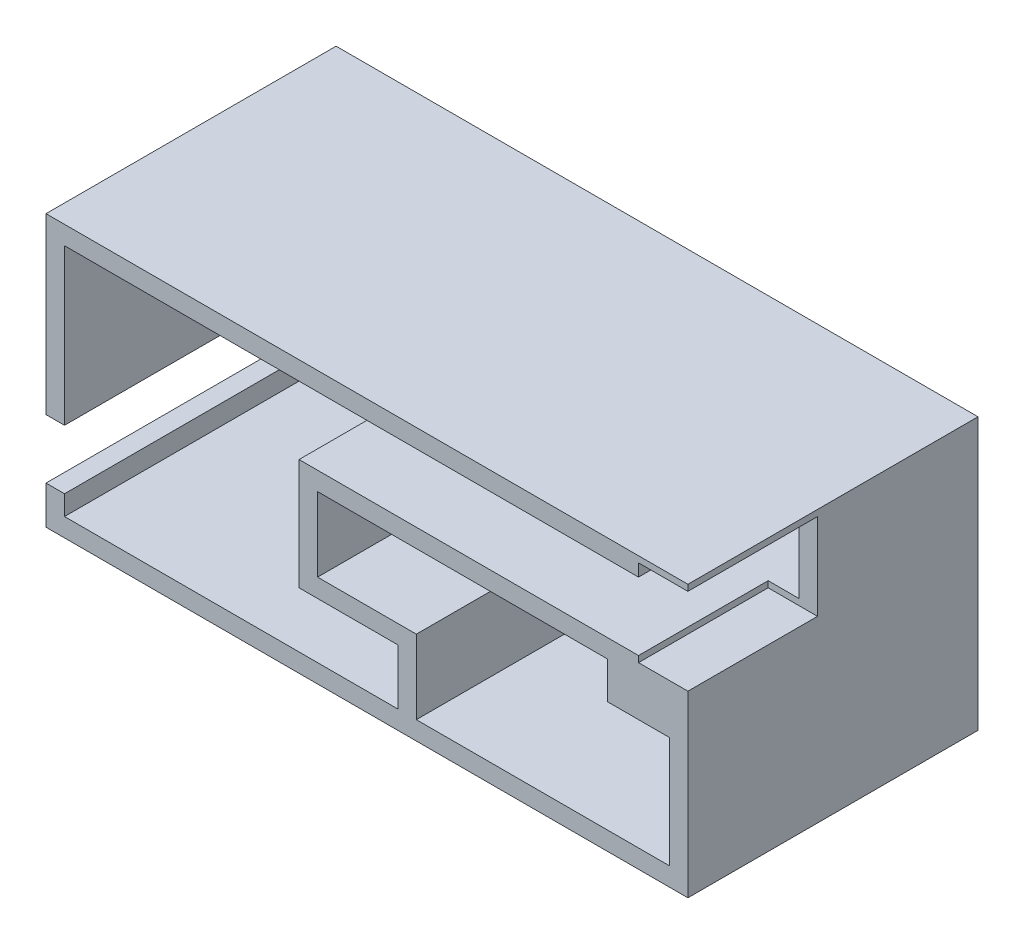
ISO-10303-21;
HEADER;
FILE_DESCRIPTION(('STEP AP214'),'2;1');
FILE_NAME('part.step','',(''),(''),'','','');
FILE_SCHEMA(('AUTOMOTIVE_DESIGN { 1 0 10303 214 1 1 1 1 }'));
ENDSEC;
DATA;
#1=APPLICATION_CONTEXT('core data for automotive mechanical design processes');
#2=APPLICATION_PROTOCOL_DEFINITION('international standard','automotive_design',2000,#1);
#3=PRODUCT_CONTEXT('',#1,'mechanical');
#4=PRODUCT('Part','Part','',(#3));
#5=PRODUCT_RELATED_PRODUCT_CATEGORY('part','',(#4));
#6=PRODUCT_DEFINITION_FORMATION('','',#4);
#7=PRODUCT_DEFINITION_CONTEXT('part definition',#1,'design');
#8=PRODUCT_DEFINITION('design','',#6,#7);
#9=PRODUCT_DEFINITION_SHAPE('','',#8);
#10=(LENGTH_UNIT() NAMED_UNIT(*) SI_UNIT(.MILLI.,.METRE.));
#11=(NAMED_UNIT(*) PLANE_ANGLE_UNIT() SI_UNIT($,.RADIAN.));
#12=(NAMED_UNIT(*) SI_UNIT($,.STERADIAN.) SOLID_ANGLE_UNIT());
#13=UNCERTAINTY_MEASURE_WITH_UNIT(LENGTH_MEASURE(1.E-05),#10,'distance_accuracy_value','');
#14=(GEOMETRIC_REPRESENTATION_CONTEXT(3) GLOBAL_UNCERTAINTY_ASSIGNED_CONTEXT((#13)) GLOBAL_UNIT_ASSIGNED_CONTEXT((#10,
#11,#12)) REPRESENTATION_CONTEXT('',''));
#15=CARTESIAN_POINT('',(0.,0.,0.));
#16=DIRECTION('',(0.,0.,1.));
#17=DIRECTION('',(1.,0.,0.));
#18=AXIS2_PLACEMENT_3D('',#15,#16,#17);
#19=CARTESIAN_POINT('',(0.,0.,23.5));
#20=DIRECTION('',(0.,0.,1.));
#21=DIRECTION('',(1.,0.,0.));
#22=AXIS2_PLACEMENT_3D('',#19,#20,#21);
#23=PLANE('',#22);
#24=DIRECTION('',(1.,0.,0.));
#25=VECTOR('',#24,1.);
#26=CARTESIAN_POINT('',(28.718487394958,21.5,23.5));
#27=LINE('',#26,#25);
#28=CARTESIAN_POINT('',(28.718487394958,21.5,23.5));
#29=VERTEX_POINT('',#28);
#30=CARTESIAN_POINT('',(32.718487394958,21.5,23.5));
#31=VERTEX_POINT('',#30);
#32=EDGE_CURVE('E269',#29,#31,#27,.T.);
#33=ORIENTED_EDGE('',*,*,#32,.T.);
#34=DIRECTION('',(0.,1.,0.));
#35=VECTOR('',#34,1.);
#36=CARTESIAN_POINT('',(32.718487394958,0.,23.5));
#37=LINE('',#36,#35);
#38=CARTESIAN_POINT('',(32.718487394958,22.,23.5));
#39=VERTEX_POINT('',#38);
#40=EDGE_CURVE('E412',#31,#39,#37,.T.);
#41=ORIENTED_EDGE('',*,*,#40,.T.);
#42=DIRECTION('',(-1.,0.,0.));
#43=VECTOR('',#42,1.);
#44=CARTESIAN_POINT('',(32.718487394958,22.,23.5));
#45=LINE('',#44,#43);
#46=CARTESIAN_POINT('',(-19.281512605042,22.,23.5));
#47=VERTEX_POINT('',#46);
#48=EDGE_CURVE('E403',#39,#47,#45,.T.);
#49=ORIENTED_EDGE('',*,*,#48,.T.);
#50=DIRECTION('',(0.,-1.,0.));
#51=VECTOR('',#50,1.);
#52=CARTESIAN_POINT('',(-19.281512605042,22.,23.5));
#53=LINE('',#52,#51);
#54=CARTESIAN_POINT('',(-19.281512605042,7.9,23.5));
#55=VERTEX_POINT('',#54);
#56=EDGE_CURVE('E407',#47,#55,#53,.T.);
#57=ORIENTED_EDGE('',*,*,#56,.T.);
#58=DIRECTION('',(-1.,0.,0.));
#59=VECTOR('',#58,1.);
#60=CARTESIAN_POINT('',(-14.281512605042,7.9,23.5));
#61=LINE('',#60,#59);
#62=CARTESIAN_POINT('',(-17.781512605042,7.9,23.5));
#63=VERTEX_POINT('',#62);
#64=EDGE_CURVE('E280',#63,#55,#61,.T.);
#65=ORIENTED_EDGE('',*,*,#64,.F.);
#66=DIRECTION('',(0.,-1.,0.));
#67=VECTOR('',#66,1.);
#68=CARTESIAN_POINT('',(-17.781512605042,20.5,23.5));
#69=LINE('',#68,#67);
#70=CARTESIAN_POINT('',(-17.781512605042,20.5,23.5));
#71=VERTEX_POINT('',#70);
#72=EDGE_CURVE('E351',#71,#63,#69,.T.);
#73=ORIENTED_EDGE('',*,*,#72,.F.);
#74=DIRECTION('',(-1.,0.,0.));
#75=VECTOR('',#74,1.);
#76=CARTESIAN_POINT('',(31.218487394958,20.5,23.5));
#77=LINE('',#76,#75);
#78=CARTESIAN_POINT('',(28.718487394958,20.5,23.5));
#79=VERTEX_POINT('',#78);
#80=EDGE_CURVE('E347',#79,#71,#77,.T.);
#81=ORIENTED_EDGE('',*,*,#80,.F.);
#82=DIRECTION('',(0.,-1.,0.));
#83=VECTOR('',#82,1.);
#84=CARTESIAN_POINT('',(28.718487394958,21.5,23.5));
#85=LINE('',#84,#83);
#86=EDGE_CURVE('E240',#29,#79,#85,.T.);
#87=ORIENTED_EDGE('',*,*,#86,.F.);
#88=EDGE_LOOP('',(#33,#41,#49,#57,#65,#73,#81,#87));
#89=FACE_BOUND('',#88,.T.);
#90=ADVANCED_FACE('F33',(#89),#23,.T.);
#91=CARTESIAN_POINT('',(-19.281512605042,0.,1.5));
#92=DIRECTION('',(1.,0.,0.));
#93=DIRECTION('',(0.,0.,-1.));
#94=AXIS2_PLACEMENT_3D('',#91,#92,#93);
#95=PLANE('',#94);
#96=CARTESIAN_POINT('',(-19.281512605042,3.1,23.5));
#97=VERTEX_POINT('',#96);
#98=CARTESIAN_POINT('',(-19.281512605042,0.,23.5));
#99=VERTEX_POINT('',#98);
#100=EDGE_CURVE('E406',#97,#99,#53,.T.);
#101=ORIENTED_EDGE('',*,*,#100,.F.);
#102=DIRECTION('',(0.,0.,1.));
#103=VECTOR('',#102,1.);
#104=CARTESIAN_POINT('',(-19.281512605042,3.1,17.75));
#105=LINE('',#104,#103);
#106=CARTESIAN_POINT('',(-19.281512605042,3.1,5.75));
#107=VERTEX_POINT('',#106);
#108=EDGE_CURVE('E278',#107,#97,#105,.T.);
#109=ORIENTED_EDGE('',*,*,#108,.F.);
#110=DIRECTION('',(0.,-1.,0.));
#111=VECTOR('',#110,1.);
#112=CARTESIAN_POINT('',(-19.281512605042,3.1,5.75));
#113=LINE('',#112,#111);
#114=CARTESIAN_POINT('',(-19.281512605042,7.9,5.75));
#115=VERTEX_POINT('',#114);
#116=EDGE_CURVE('E275',#115,#107,#113,.T.);
#117=ORIENTED_EDGE('',*,*,#116,.F.);
#118=DIRECTION('',(0.,0.,-1.));
#119=VECTOR('',#118,1.);
#120=CARTESIAN_POINT('',(-19.281512605042,7.9,5.75));
#121=LINE('',#120,#119);
#122=EDGE_CURVE('E273',#55,#115,#121,.T.);
#123=ORIENTED_EDGE('',*,*,#122,.F.);
#124=ORIENTED_EDGE('',*,*,#56,.F.);
#125=DIRECTION('',(0.,0.,-1.));
#126=VECTOR('',#125,1.);
#127=CARTESIAN_POINT('',(-19.281512605042,22.,1.5));
#128=LINE('',#127,#126);
#129=CARTESIAN_POINT('',(-19.281512605042,22.,0.));
#130=VERTEX_POINT('',#129);
#131=EDGE_CURVE('E423',#47,#130,#128,.T.);
#132=ORIENTED_EDGE('',*,*,#131,.T.);
#133=DIRECTION('',(0.,-1.,0.));
#134=VECTOR('',#133,1.);
#135=CARTESIAN_POINT('',(-19.281512605042,0.,0.));
#136=LINE('',#135,#134);
#137=CARTESIAN_POINT('',(-19.281512605042,0.,0.));
#138=VERTEX_POINT('',#137);
#139=EDGE_CURVE('E414',#130,#138,#136,.T.);
#140=ORIENTED_EDGE('',*,*,#139,.T.);
#141=DIRECTION('',(0.,0.,-1.));
#142=VECTOR('',#141,1.);
#143=CARTESIAN_POINT('',(-19.281512605042,0.,1.5));
#144=LINE('',#143,#142);
#145=EDGE_CURVE('E432',#99,#138,#144,.T.);
#146=ORIENTED_EDGE('',*,*,#145,.F.);
#147=EDGE_LOOP('',(#101,#109,#117,#123,#124,#132,#140,#146));
#148=FACE_BOUND('',#147,.T.);
#149=ADVANCED_FACE('F35',(#148),#95,.F.);
#150=CARTESIAN_POINT('',(-19.281512605042,0.,1.5));
#151=DIRECTION('',(0.,1.,0.));
#152=DIRECTION('',(0.,0.,1.));
#153=AXIS2_PLACEMENT_3D('',#150,#151,#152);
#154=PLANE('',#153);
#155=DIRECTION('',(1.,0.,0.));
#156=VECTOR('',#155,1.);
#157=CARTESIAN_POINT('',(-19.281512605042,0.,0.));
#158=LINE('',#157,#156);
#159=CARTESIAN_POINT('',(32.718487394958,0.,0.));
#160=VERTEX_POINT('',#159);
#161=EDGE_CURVE('E417',#138,#160,#158,.T.);
#162=ORIENTED_EDGE('',*,*,#161,.T.);
#163=DIRECTION('',(0.,0.,-1.));
#164=VECTOR('',#163,1.);
#165=CARTESIAN_POINT('',(32.718487394958,0.,1.5));
#166=LINE('',#165,#164);
#167=CARTESIAN_POINT('',(32.718487394958,0.,23.5));
#168=VERTEX_POINT('',#167);
#169=EDGE_CURVE('E429',#168,#160,#166,.T.);
#170=ORIENTED_EDGE('',*,*,#169,.F.);
#171=DIRECTION('',(1.,0.,0.));
#172=VECTOR('',#171,1.);
#173=CARTESIAN_POINT('',(-19.281512605042,0.,23.5));
#174=LINE('',#173,#172);
#175=EDGE_CURVE('E410',#99,#168,#174,.T.);
#176=ORIENTED_EDGE('',*,*,#175,.F.);
#177=ORIENTED_EDGE('',*,*,#145,.T.);
#178=EDGE_LOOP('',(#162,#170,#176,#177));
#179=FACE_BOUND('',#178,.T.);
#180=ADVANCED_FACE('F495',(#179),#154,.F.);
#181=CARTESIAN_POINT('',(32.718487394958,0.,1.5));
#182=DIRECTION('',(-1.,0.,0.));
#183=DIRECTION('',(0.,-1.,0.));
#184=AXIS2_PLACEMENT_3D('',#181,#182,#183);
#185=PLANE('',#184);
#186=ORIENTED_EDGE('',*,*,#40,.F.);
#187=DIRECTION('',(0.,0.,1.));
#188=VECTOR('',#187,1.);
#189=CARTESIAN_POINT('',(32.718487394958,21.5,23.5));
#190=LINE('',#189,#188);
#191=CARTESIAN_POINT('',(32.718487394958,21.5,13.));
#192=VERTEX_POINT('',#191);
#193=EDGE_CURVE('E241',#192,#31,#190,.T.);
#194=ORIENTED_EDGE('',*,*,#193,.F.);
#195=DIRECTION('',(0.,1.,0.));
#196=VECTOR('',#195,1.);
#197=CARTESIAN_POINT('',(32.718487394958,21.5,13.));
#198=LINE('',#197,#196);
#199=CARTESIAN_POINT('',(32.718487394958,14.5,13.));
#200=VERTEX_POINT('',#199);
#201=EDGE_CURVE('E515',#200,#192,#198,.T.);
#202=ORIENTED_EDGE('',*,*,#201,.F.);
#203=DIRECTION('',(0.,0.,-1.));
#204=VECTOR('',#203,1.);
#205=CARTESIAN_POINT('',(32.718487394958,14.5,13.));
#206=LINE('',#205,#204);
#207=CARTESIAN_POINT('',(32.718487394958,14.5,23.5));
#208=VERTEX_POINT('',#207);
#209=EDGE_CURVE('E518',#208,#200,#206,.T.);
#210=ORIENTED_EDGE('',*,*,#209,.F.);
#211=EDGE_CURVE('E257',#168,#208,#37,.T.);
#212=ORIENTED_EDGE('',*,*,#211,.F.);
#213=ORIENTED_EDGE('',*,*,#169,.T.);
#214=DIRECTION('',(0.,1.,0.));
#215=VECTOR('',#214,1.);
#216=CARTESIAN_POINT('',(32.718487394958,0.,0.));
#217=LINE('',#216,#215);
#218=CARTESIAN_POINT('',(32.718487394958,22.,0.));
#219=VERTEX_POINT('',#218);
#220=EDGE_CURVE('E419',#160,#219,#217,.T.);
#221=ORIENTED_EDGE('',*,*,#220,.T.);
#222=DIRECTION('',(0.,0.,-1.));
#223=VECTOR('',#222,1.);
#224=CARTESIAN_POINT('',(32.718487394958,22.,1.5));
#225=LINE('',#224,#223);
#226=EDGE_CURVE('E426',#39,#219,#225,.T.);
#227=ORIENTED_EDGE('',*,*,#226,.F.);
#228=EDGE_LOOP('',(#186,#194,#202,#210,#212,#213,#221,#227));
#229=FACE_BOUND('',#228,.T.);
#230=ADVANCED_FACE('F499',(#229),#185,.F.);
#231=CARTESIAN_POINT('',(-19.281512605042,22.,1.5));
#232=DIRECTION('',(0.,-1.,0.));
#233=DIRECTION('',(0.,0.,-1.));
#234=AXIS2_PLACEMENT_3D('',#231,#232,#233);
#235=PLANE('',#234);
#236=DIRECTION('',(-1.,0.,0.));
#237=VECTOR('',#236,1.);
#238=CARTESIAN_POINT('',(-19.281512605042,22.,0.));
#239=LINE('',#238,#237);
#240=EDGE_CURVE('E421',#219,#130,#239,.T.);
#241=ORIENTED_EDGE('',*,*,#240,.T.);
#242=ORIENTED_EDGE('',*,*,#131,.F.);
#243=ORIENTED_EDGE('',*,*,#48,.F.);
#244=ORIENTED_EDGE('',*,*,#226,.T.);
#245=EDGE_LOOP('',(#241,#242,#243,#244));
#246=FACE_BOUND('',#245,.T.);
#247=ADVANCED_FACE('F505',(#246),#235,.F.);
#248=CARTESIAN_POINT('',(0.,0.,0.));
#249=DIRECTION('',(0.,0.,-1.));
#250=DIRECTION('',(-1.,0.,0.));
#251=AXIS2_PLACEMENT_3D('',#248,#249,#250);
#252=PLANE('',#251);
#253=ORIENTED_EDGE('',*,*,#139,.F.);
#254=ORIENTED_EDGE('',*,*,#240,.F.);
#255=ORIENTED_EDGE('',*,*,#220,.F.);
#256=ORIENTED_EDGE('',*,*,#161,.F.);
#257=EDGE_LOOP('',(#253,#254,#255,#256));
#258=FACE_BOUND('',#257,.T.);
#259=ADVANCED_FACE('F503',(#258),#252,.T.);
#260=DIRECTION('',(1.,0.,0.));
#261=VECTOR('',#260,1.);
#262=CARTESIAN_POINT('',(28.718487394958,14.5,23.5));
#263=LINE('',#262,#261);
#264=CARTESIAN_POINT('',(28.718487394958,14.5,23.5));
#265=VERTEX_POINT('',#264);
#266=EDGE_CURVE('E246',#265,#208,#263,.T.);
#267=ORIENTED_EDGE('',*,*,#266,.F.);
#268=CARTESIAN_POINT('',(28.718487394958,15.,23.5));
#269=VERTEX_POINT('',#268);
#270=EDGE_CURVE('E230',#269,#265,#85,.T.);
#271=ORIENTED_EDGE('',*,*,#270,.F.);
#272=DIRECTION('',(1.,0.,0.));
#273=VECTOR('',#272,1.);
#274=CARTESIAN_POINT('',(31.218487394958,15.,23.5));
#275=LINE('',#274,#273);
#276=CARTESIAN_POINT('',(1.21848739495798,15.,23.5));
#277=VERTEX_POINT('',#276);
#278=EDGE_CURVE('E362',#277,#269,#275,.T.);
#279=ORIENTED_EDGE('',*,*,#278,.F.);
#280=DIRECTION('',(0.,1.,0.));
#281=VECTOR('',#280,1.);
#282=CARTESIAN_POINT('',(1.21848739495798,15.,23.5));
#283=LINE('',#282,#281);
#284=CARTESIAN_POINT('',(1.21848739495798,6.,23.5));
#285=VERTEX_POINT('',#284);
#286=EDGE_CURVE('E360',#285,#277,#283,.T.);
#287=ORIENTED_EDGE('',*,*,#286,.F.);
#288=DIRECTION('',(-1.,0.,0.));
#289=VECTOR('',#288,1.);
#290=CARTESIAN_POINT('',(1.21848739495798,6.,23.5));
#291=LINE('',#290,#289);
#292=CARTESIAN_POINT('',(9.21848739495798,6.,23.5));
#293=VERTEX_POINT('',#292);
#294=EDGE_CURVE('E358',#293,#285,#291,.T.);
#295=ORIENTED_EDGE('',*,*,#294,.F.);
#296=DIRECTION('',(0.,1.,0.));
#297=VECTOR('',#296,1.);
#298=CARTESIAN_POINT('',(9.21848739495798,6.,23.5));
#299=LINE('',#298,#297);
#300=CARTESIAN_POINT('',(9.21848739495798,1.5,23.5));
#301=VERTEX_POINT('',#300);
#302=EDGE_CURVE('E356',#301,#293,#299,.T.);
#303=ORIENTED_EDGE('',*,*,#302,.F.);
#304=DIRECTION('',(1.,0.,0.));
#305=VECTOR('',#304,1.);
#306=CARTESIAN_POINT('',(-17.781512605042,1.5,23.5));
#307=LINE('',#306,#305);
#308=CARTESIAN_POINT('',(-17.781512605042,1.5,23.5));
#309=VERTEX_POINT('',#308);
#310=EDGE_CURVE('E354',#309,#301,#307,.T.);
#311=ORIENTED_EDGE('',*,*,#310,.F.);
#312=CARTESIAN_POINT('',(-17.781512605042,3.1,23.5));
#313=VERTEX_POINT('',#312);
#314=EDGE_CURVE('E349',#313,#309,#69,.T.);
#315=ORIENTED_EDGE('',*,*,#314,.F.);
#316=DIRECTION('',(-1.,0.,0.));
#317=VECTOR('',#316,1.);
#318=CARTESIAN_POINT('',(-14.281512605042,3.1,23.5));
#319=LINE('',#318,#317);
#320=EDGE_CURVE('E283',#313,#97,#319,.T.);
#321=ORIENTED_EDGE('',*,*,#320,.T.);
#322=ORIENTED_EDGE('',*,*,#100,.T.);
#323=ORIENTED_EDGE('',*,*,#175,.T.);
#324=ORIENTED_EDGE('',*,*,#211,.T.);
#325=EDGE_LOOP('',(#267,#271,#279,#287,#295,#303,#311,#315,#321,#322,#323,#324));
#326=FACE_BOUND('',#325,.T.);
#327=DIRECTION('',(0.,1.,0.));
#328=VECTOR('',#327,1.);
#329=CARTESIAN_POINT('',(31.218487394958,1.5,23.5));
#330=LINE('',#329,#328);
#331=CARTESIAN_POINT('',(31.218487394958,1.5,23.5));
#332=VERTEX_POINT('',#331);
#333=CARTESIAN_POINT('',(31.218487394958,10.5,23.5));
#334=VERTEX_POINT('',#333);
#335=EDGE_CURVE('E291',#332,#334,#330,.T.);
#336=ORIENTED_EDGE('',*,*,#335,.F.);
#337=DIRECTION('',(1.,0.,0.));
#338=VECTOR('',#337,1.);
#339=CARTESIAN_POINT('',(10.718487394958,1.5,23.5));
#340=LINE('',#339,#338);
#341=CARTESIAN_POINT('',(10.718487394958,1.5,23.5));
#342=VERTEX_POINT('',#341);
#343=EDGE_CURVE('E289',#342,#332,#340,.T.);
#344=ORIENTED_EDGE('',*,*,#343,.F.);
#345=DIRECTION('',(0.,-1.,0.));
#346=VECTOR('',#345,1.);
#347=CARTESIAN_POINT('',(10.718487394958,7.5,23.5));
#348=LINE('',#347,#346);
#349=CARTESIAN_POINT('',(10.718487394958,7.5,23.5));
#350=VERTEX_POINT('',#349);
#351=EDGE_CURVE('E305',#350,#342,#348,.T.);
#352=ORIENTED_EDGE('',*,*,#351,.F.);
#353=DIRECTION('',(1.,0.,0.));
#354=VECTOR('',#353,1.);
#355=CARTESIAN_POINT('',(2.71848739495798,7.5,23.5));
#356=LINE('',#355,#354);
#357=CARTESIAN_POINT('',(2.71848739495798,7.5,23.5));
#358=VERTEX_POINT('',#357);
#359=EDGE_CURVE('E302',#358,#350,#356,.T.);
#360=ORIENTED_EDGE('',*,*,#359,.F.);
#361=DIRECTION('',(0.,-1.,0.));
#362=VECTOR('',#361,1.);
#363=CARTESIAN_POINT('',(2.71848739495798,13.5,23.5));
#364=LINE('',#363,#362);
#365=CARTESIAN_POINT('',(2.71848739495798,13.5,23.5));
#366=VERTEX_POINT('',#365);
#367=EDGE_CURVE('E300',#366,#358,#364,.T.);
#368=ORIENTED_EDGE('',*,*,#367,.F.);
#369=DIRECTION('',(-1.,0.,0.));
#370=VECTOR('',#369,1.);
#371=CARTESIAN_POINT('',(26.218487394958,13.5,23.5));
#372=LINE('',#371,#370);
#373=CARTESIAN_POINT('',(26.218487394958,13.5,23.5));
#374=VERTEX_POINT('',#373);
#375=EDGE_CURVE('E298',#374,#366,#372,.T.);
#376=ORIENTED_EDGE('',*,*,#375,.F.);
#377=DIRECTION('',(0.,1.,0.));
#378=VECTOR('',#377,1.);
#379=CARTESIAN_POINT('',(26.218487394958,13.5,23.5));
#380=LINE('',#379,#378);
#381=CARTESIAN_POINT('',(26.218487394958,10.5,23.5));
#382=VERTEX_POINT('',#381);
#383=EDGE_CURVE('E296',#382,#374,#380,.T.);
#384=ORIENTED_EDGE('',*,*,#383,.F.);
#385=DIRECTION('',(-1.,0.,0.));
#386=VECTOR('',#385,1.);
#387=CARTESIAN_POINT('',(26.218487394958,10.5,23.5));
#388=LINE('',#387,#386);
#389=EDGE_CURVE('E294',#334,#382,#388,.T.);
#390=ORIENTED_EDGE('',*,*,#389,.F.);
#391=EDGE_LOOP('',(#336,#344,#352,#360,#368,#376,#384,#390));
#392=FACE_BOUND('',#391,.T.);
#393=ADVANCED_FACE('F253',(#326,#392),#23,.T.);
#394=CARTESIAN_POINT('',(31.218487394958,20.5,23.5));
#395=DIRECTION('',(0.,-1.,0.));
#396=DIRECTION('',(0.,0.,-1.));
#397=AXIS2_PLACEMENT_3D('',#394,#395,#396);
#398=PLANE('',#397);
#399=DIRECTION('',(1.,0.,0.));
#400=VECTOR('',#399,1.);
#401=CARTESIAN_POINT('',(31.218487394958,20.5,13.));
#402=LINE('',#401,#400);
#403=CARTESIAN_POINT('',(28.718487394958,20.5,13.));
#404=VERTEX_POINT('',#403);
#405=CARTESIAN_POINT('',(31.218487394958,20.5,13.));
#406=VERTEX_POINT('',#405);
#407=EDGE_CURVE('E48',#404,#406,#402,.T.);
#408=ORIENTED_EDGE('',*,*,#407,.F.);
#409=DIRECTION('',(0.,0.,-1.));
#410=VECTOR('',#409,1.);
#411=CARTESIAN_POINT('',(28.718487394958,20.5,23.5));
#412=LINE('',#411,#410);
#413=EDGE_CURVE('E271',#79,#404,#412,.T.);
#414=ORIENTED_EDGE('',*,*,#413,.F.);
#415=ORIENTED_EDGE('',*,*,#80,.T.);
#416=DIRECTION('',(0.,0.,-1.));
#417=VECTOR('',#416,1.);
#418=CARTESIAN_POINT('',(-17.781512605042,20.5,23.5));
#419=LINE('',#418,#417);
#420=CARTESIAN_POINT('',(-17.781512605042,20.5,1.5));
#421=VERTEX_POINT('',#420);
#422=EDGE_CURVE('E400',#71,#421,#419,.T.);
#423=ORIENTED_EDGE('',*,*,#422,.T.);
#424=DIRECTION('',(-1.,0.,0.));
#425=VECTOR('',#424,1.);
#426=CARTESIAN_POINT('',(31.218487394958,20.5,1.5));
#427=LINE('',#426,#425);
#428=CARTESIAN_POINT('',(31.218487394958,20.5,1.5));
#429=VERTEX_POINT('',#428);
#430=EDGE_CURVE('E346',#429,#421,#427,.T.);
#431=ORIENTED_EDGE('',*,*,#430,.F.);
#432=DIRECTION('',(0.,0.,-1.));
#433=VECTOR('',#432,1.);
#434=CARTESIAN_POINT('',(31.218487394958,20.5,23.5));
#435=LINE('',#434,#433);
#436=EDGE_CURVE('E364',#406,#429,#435,.T.);
#437=ORIENTED_EDGE('',*,*,#436,.F.);
#438=EDGE_LOOP('',(#408,#414,#415,#423,#431,#437));
#439=FACE_BOUND('',#438,.T.);
#440=ADVANCED_FACE('F531',(#439),#398,.T.);
#441=CARTESIAN_POINT('',(-17.781512605042,20.5,23.5));
#442=DIRECTION('',(1.,0.,0.));
#443=DIRECTION('',(0.,0.,-1.));
#444=AXIS2_PLACEMENT_3D('',#441,#442,#443);
#445=PLANE('',#444);
#446=DIRECTION('',(0.,0.,-1.));
#447=VECTOR('',#446,1.);
#448=CARTESIAN_POINT('',(-17.781512605042,3.1,23.5));
#449=LINE('',#448,#447);
#450=CARTESIAN_POINT('',(-17.781512605042,3.1,5.75));
#451=VERTEX_POINT('',#450);
#452=EDGE_CURVE('E439',#313,#451,#449,.T.);
#453=ORIENTED_EDGE('',*,*,#452,.F.);
#454=ORIENTED_EDGE('',*,*,#314,.T.);
#455=DIRECTION('',(0.,0.,-1.));
#456=VECTOR('',#455,1.);
#457=CARTESIAN_POINT('',(-17.781512605042,1.5,23.5));
#458=LINE('',#457,#456);
#459=CARTESIAN_POINT('',(-17.781512605042,1.5,1.5));
#460=VERTEX_POINT('',#459);
#461=EDGE_CURVE('E398',#309,#460,#458,.T.);
#462=ORIENTED_EDGE('',*,*,#461,.T.);
#463=DIRECTION('',(0.,-1.,0.));
#464=VECTOR('',#463,1.);
#465=CARTESIAN_POINT('',(-17.781512605042,20.5,1.5));
#466=LINE('',#465,#464);
#467=EDGE_CURVE('E367',#421,#460,#466,.T.);
#468=ORIENTED_EDGE('',*,*,#467,.F.);
#469=ORIENTED_EDGE('',*,*,#422,.F.);
#470=ORIENTED_EDGE('',*,*,#72,.T.);
#471=DIRECTION('',(0.,0.,1.));
#472=VECTOR('',#471,1.);
#473=CARTESIAN_POINT('',(-17.781512605042,7.9,23.5));
#474=LINE('',#473,#472);
#475=CARTESIAN_POINT('',(-17.781512605042,7.9,5.75000000000001));
#476=VERTEX_POINT('',#475);
#477=EDGE_CURVE('E435',#476,#63,#474,.T.);
#478=ORIENTED_EDGE('',*,*,#477,.F.);
#479=DIRECTION('',(0.,1.,0.));
#480=VECTOR('',#479,1.);
#481=CARTESIAN_POINT('',(-17.781512605042,20.5,5.75000000000001));
#482=LINE('',#481,#480);
#483=EDGE_CURVE('E437',#451,#476,#482,.T.);
#484=ORIENTED_EDGE('',*,*,#483,.F.);
#485=EDGE_LOOP('',(#453,#454,#462,#468,#469,#470,#478,#484));
#486=FACE_BOUND('',#485,.T.);
#487=ADVANCED_FACE('F477',(#486),#445,.T.);
#488=CARTESIAN_POINT('',(-17.781512605042,1.5,23.5));
#489=DIRECTION('',(0.,1.,0.));
#490=DIRECTION('',(-1.,0.,0.));
#491=AXIS2_PLACEMENT_3D('',#488,#489,#490);
#492=PLANE('',#491);
#493=DIRECTION('',(1.,0.,0.));
#494=VECTOR('',#493,1.);
#495=CARTESIAN_POINT('',(-17.781512605042,1.5,1.5));
#496=LINE('',#495,#494);
#497=CARTESIAN_POINT('',(9.21848739495798,1.5,1.5));
#498=VERTEX_POINT('',#497);
#499=EDGE_CURVE('E370',#460,#498,#496,.T.);
#500=ORIENTED_EDGE('',*,*,#499,.F.);
#501=ORIENTED_EDGE('',*,*,#461,.F.);
#502=ORIENTED_EDGE('',*,*,#310,.T.);
#503=DIRECTION('',(0.,0.,-1.));
#504=VECTOR('',#503,1.);
#505=CARTESIAN_POINT('',(9.21848739495798,1.5,23.5));
#506=LINE('',#505,#504);
#507=EDGE_CURVE('E396',#301,#498,#506,.T.);
#508=ORIENTED_EDGE('',*,*,#507,.T.);
#509=EDGE_LOOP('',(#500,#501,#502,#508));
#510=FACE_BOUND('',#509,.T.);
#511=ADVANCED_FACE('F474',(#510),#492,.T.);
#512=CARTESIAN_POINT('',(9.21848739495798,6.,23.5));
#513=DIRECTION('',(-1.,0.,0.));
#514=DIRECTION('',(0.,-1.,0.));
#515=AXIS2_PLACEMENT_3D('',#512,#513,#514);
#516=PLANE('',#515);
#517=DIRECTION('',(0.,1.,0.));
#518=VECTOR('',#517,1.);
#519=CARTESIAN_POINT('',(9.21848739495798,6.,1.5));
#520=LINE('',#519,#518);
#521=CARTESIAN_POINT('',(9.21848739495798,6.,1.5));
#522=VERTEX_POINT('',#521);
#523=EDGE_CURVE('E373',#498,#522,#520,.T.);
#524=ORIENTED_EDGE('',*,*,#523,.F.);
#525=ORIENTED_EDGE('',*,*,#507,.F.);
#526=ORIENTED_EDGE('',*,*,#302,.T.);
#527=DIRECTION('',(0.,0.,-1.));
#528=VECTOR('',#527,1.);
#529=CARTESIAN_POINT('',(9.21848739495798,6.,23.5));
#530=LINE('',#529,#528);
#531=EDGE_CURVE('E394',#293,#522,#530,.T.);
#532=ORIENTED_EDGE('',*,*,#531,.T.);
#533=EDGE_LOOP('',(#524,#525,#526,#532));
#534=FACE_BOUND('',#533,.T.);
#535=ADVANCED_FACE('F467',(#534),#516,.T.);
#536=CARTESIAN_POINT('',(1.21848739495798,6.,23.5));
#537=DIRECTION('',(0.,-1.,0.));
#538=DIRECTION('',(0.,0.,-1.));
#539=AXIS2_PLACEMENT_3D('',#536,#537,#538);
#540=PLANE('',#539);
#541=DIRECTION('',(-1.,0.,0.));
#542=VECTOR('',#541,1.);
#543=CARTESIAN_POINT('',(1.21848739495798,6.,1.5));
#544=LINE('',#543,#542);
#545=CARTESIAN_POINT('',(1.21848739495798,6.,1.5));
#546=VERTEX_POINT('',#545);
#547=EDGE_CURVE('E376',#522,#546,#544,.T.);
#548=ORIENTED_EDGE('',*,*,#547,.F.);
#549=ORIENTED_EDGE('',*,*,#531,.F.);
#550=ORIENTED_EDGE('',*,*,#294,.T.);
#551=DIRECTION('',(0.,0.,-1.));
#552=VECTOR('',#551,1.);
#553=CARTESIAN_POINT('',(1.21848739495798,6.,23.5));
#554=LINE('',#553,#552);
#555=EDGE_CURVE('E392',#285,#546,#554,.T.);
#556=ORIENTED_EDGE('',*,*,#555,.T.);
#557=EDGE_LOOP('',(#548,#549,#550,#556));
#558=FACE_BOUND('',#557,.T.);
#559=ADVANCED_FACE('F463',(#558),#540,.T.);
#560=CARTESIAN_POINT('',(1.21848739495798,15.,23.5));
#561=DIRECTION('',(-1.,0.,0.));
#562=DIRECTION('',(0.,-1.,0.));
#563=AXIS2_PLACEMENT_3D('',#560,#561,#562);
#564=PLANE('',#563);
#565=DIRECTION('',(0.,1.,0.));
#566=VECTOR('',#565,1.);
#567=CARTESIAN_POINT('',(1.21848739495798,15.,1.5));
#568=LINE('',#567,#566);
#569=CARTESIAN_POINT('',(1.21848739495798,15.,1.5));
#570=VERTEX_POINT('',#569);
#571=EDGE_CURVE('E379',#546,#570,#568,.T.);
#572=ORIENTED_EDGE('',*,*,#571,.F.);
#573=ORIENTED_EDGE('',*,*,#555,.F.);
#574=ORIENTED_EDGE('',*,*,#286,.T.);
#575=DIRECTION('',(0.,0.,-1.));
#576=VECTOR('',#575,1.);
#577=CARTESIAN_POINT('',(1.21848739495798,15.,23.5));
#578=LINE('',#577,#576);
#579=EDGE_CURVE('E390',#277,#570,#578,.T.);
#580=ORIENTED_EDGE('',*,*,#579,.T.);
#581=EDGE_LOOP('',(#572,#573,#574,#580));
#582=FACE_BOUND('',#581,.T.);
#583=ADVANCED_FACE('F460',(#582),#564,.T.);
#584=CARTESIAN_POINT('',(31.218487394958,15.,23.5));
#585=DIRECTION('',(0.,1.,0.));
#586=DIRECTION('',(0.,0.,1.));
#587=AXIS2_PLACEMENT_3D('',#584,#585,#586);
#588=PLANE('',#587);
#589=DIRECTION('',(-1.,0.,0.));
#590=VECTOR('',#589,1.);
#591=CARTESIAN_POINT('',(31.218487394958,15.,13.));
#592=LINE('',#591,#590);
#593=CARTESIAN_POINT('',(31.218487394958,15.,13.));
#594=VERTEX_POINT('',#593);
#595=CARTESIAN_POINT('',(28.718487394958,15.,13.));
#596=VERTEX_POINT('',#595);
#597=EDGE_CURVE('E267',#594,#596,#592,.T.);
#598=ORIENTED_EDGE('',*,*,#597,.F.);
#599=DIRECTION('',(0.,0.,-1.));
#600=VECTOR('',#599,1.);
#601=CARTESIAN_POINT('',(31.218487394958,15.,23.5));
#602=LINE('',#601,#600);
#603=CARTESIAN_POINT('',(31.218487394958,15.,1.5));
#604=VERTEX_POINT('',#603);
#605=EDGE_CURVE('E388',#594,#604,#602,.T.);
#606=ORIENTED_EDGE('',*,*,#605,.T.);
#607=DIRECTION('',(1.,0.,0.));
#608=VECTOR('',#607,1.);
#609=CARTESIAN_POINT('',(31.218487394958,15.,1.5));
#610=LINE('',#609,#608);
#611=EDGE_CURVE('E382',#570,#604,#610,.T.);
#612=ORIENTED_EDGE('',*,*,#611,.F.);
#613=ORIENTED_EDGE('',*,*,#579,.F.);
#614=ORIENTED_EDGE('',*,*,#278,.T.);
#615=DIRECTION('',(0.,0.,1.));
#616=VECTOR('',#615,1.);
#617=CARTESIAN_POINT('',(28.718487394958,15.,23.5));
#618=LINE('',#617,#616);
#619=EDGE_CURVE('E11',#596,#269,#618,.T.);
#620=ORIENTED_EDGE('',*,*,#619,.F.);
#621=EDGE_LOOP('',(#598,#606,#612,#613,#614,#620));
#622=FACE_BOUND('',#621,.T.);
#623=ADVANCED_FACE('F446',(#622),#588,.T.);
#624=CARTESIAN_POINT('',(31.218487394958,15.,23.5));
#625=DIRECTION('',(-1.,0.,0.));
#626=DIRECTION('',(0.,-1.,0.));
#627=AXIS2_PLACEMENT_3D('',#624,#625,#626);
#628=PLANE('',#627);
#629=DIRECTION('',(0.,-1.,0.));
#630=VECTOR('',#629,1.);
#631=CARTESIAN_POINT('',(31.218487394958,15.,13.));
#632=LINE('',#631,#630);
#633=EDGE_CURVE('E41',#406,#594,#632,.T.);
#634=ORIENTED_EDGE('',*,*,#633,.F.);
#635=ORIENTED_EDGE('',*,*,#436,.T.);
#636=DIRECTION('',(0.,1.,0.));
#637=VECTOR('',#636,1.);
#638=CARTESIAN_POINT('',(31.218487394958,15.,1.5));
#639=LINE('',#638,#637);
#640=EDGE_CURVE('E350',#604,#429,#639,.T.);
#641=ORIENTED_EDGE('',*,*,#640,.F.);
#642=ORIENTED_EDGE('',*,*,#605,.F.);
#643=EDGE_LOOP('',(#634,#635,#641,#642));
#644=FACE_BOUND('',#643,.T.);
#645=ADVANCED_FACE('F449',(#644),#628,.T.);
#646=CARTESIAN_POINT('',(10.718487394958,1.5,23.5));
#647=DIRECTION('',(0.,1.,0.));
#648=DIRECTION('',(-1.,0.,0.));
#649=AXIS2_PLACEMENT_3D('',#646,#647,#648);
#650=PLANE('',#649);
#651=DIRECTION('',(1.,0.,0.));
#652=VECTOR('',#651,1.);
#653=CARTESIAN_POINT('',(10.718487394958,1.5,1.5));
#654=LINE('',#653,#652);
#655=CARTESIAN_POINT('',(10.718487394958,1.5,1.5));
#656=VERTEX_POINT('',#655);
#657=CARTESIAN_POINT('',(31.218487394958,1.5,1.5));
#658=VERTEX_POINT('',#657);
#659=EDGE_CURVE('E282',#656,#658,#654,.T.);
#660=ORIENTED_EDGE('',*,*,#659,.F.);
#661=DIRECTION('',(0.,0.,-1.));
#662=VECTOR('',#661,1.);
#663=CARTESIAN_POINT('',(10.718487394958,1.5,23.5));
#664=LINE('',#663,#662);
#665=EDGE_CURVE('E307',#342,#656,#664,.T.);
#666=ORIENTED_EDGE('',*,*,#665,.F.);
#667=ORIENTED_EDGE('',*,*,#343,.T.);
#668=DIRECTION('',(0.,0.,-1.));
#669=VECTOR('',#668,1.);
#670=CARTESIAN_POINT('',(31.218487394958,1.5,23.5));
#671=LINE('',#670,#669);
#672=EDGE_CURVE('E343',#332,#658,#671,.T.);
#673=ORIENTED_EDGE('',*,*,#672,.T.);
#674=EDGE_LOOP('',(#660,#666,#667,#673));
#675=FACE_BOUND('',#674,.T.);
#676=ADVANCED_FACE('F619',(#675),#650,.T.);
#677=CARTESIAN_POINT('',(31.218487394958,1.5,23.5));
#678=DIRECTION('',(-1.,0.,0.));
#679=DIRECTION('',(0.,-1.,0.));
#680=AXIS2_PLACEMENT_3D('',#677,#678,#679);
#681=PLANE('',#680);
#682=DIRECTION('',(0.,1.,0.));
#683=VECTOR('',#682,1.);
#684=CARTESIAN_POINT('',(31.218487394958,1.5,1.5));
#685=LINE('',#684,#683);
#686=CARTESIAN_POINT('',(31.218487394958,10.5,1.5));
#687=VERTEX_POINT('',#686);
#688=EDGE_CURVE('E310',#658,#687,#685,.T.);
#689=ORIENTED_EDGE('',*,*,#688,.F.);
#690=ORIENTED_EDGE('',*,*,#672,.F.);
#691=ORIENTED_EDGE('',*,*,#335,.T.);
#692=DIRECTION('',(0.,0.,-1.));
#693=VECTOR('',#692,1.);
#694=CARTESIAN_POINT('',(31.218487394958,10.5,23.5));
#695=LINE('',#694,#693);
#696=EDGE_CURVE('E341',#334,#687,#695,.T.);
#697=ORIENTED_EDGE('',*,*,#696,.T.);
#698=EDGE_LOOP('',(#689,#690,#691,#697));
#699=FACE_BOUND('',#698,.T.);
#700=ADVANCED_FACE('F624',(#699),#681,.T.);
#701=CARTESIAN_POINT('',(26.218487394958,10.5,23.5));
#702=DIRECTION('',(0.,-1.,0.));
#703=DIRECTION('',(0.,0.,-1.));
#704=AXIS2_PLACEMENT_3D('',#701,#702,#703);
#705=PLANE('',#704);
#706=DIRECTION('',(-1.,0.,0.));
#707=VECTOR('',#706,1.);
#708=CARTESIAN_POINT('',(26.218487394958,10.5,1.5));
#709=LINE('',#708,#707);
#710=CARTESIAN_POINT('',(26.218487394958,10.5,1.5));
#711=VERTEX_POINT('',#710);
#712=EDGE_CURVE('E313',#687,#711,#709,.T.);
#713=ORIENTED_EDGE('',*,*,#712,.F.);
#714=ORIENTED_EDGE('',*,*,#696,.F.);
#715=ORIENTED_EDGE('',*,*,#389,.T.);
#716=DIRECTION('',(0.,0.,-1.));
#717=VECTOR('',#716,1.);
#718=CARTESIAN_POINT('',(26.218487394958,10.5,23.5));
#719=LINE('',#718,#717);
#720=EDGE_CURVE('E339',#382,#711,#719,.T.);
#721=ORIENTED_EDGE('',*,*,#720,.T.);
#722=EDGE_LOOP('',(#713,#714,#715,#721));
#723=FACE_BOUND('',#722,.T.);
#724=ADVANCED_FACE('F636',(#723),#705,.T.);
#725=CARTESIAN_POINT('',(26.218487394958,13.5,23.5));
#726=DIRECTION('',(-1.,0.,0.));
#727=DIRECTION('',(0.,0.,1.));
#728=AXIS2_PLACEMENT_3D('',#725,#726,#727);
#729=PLANE('',#728);
#730=DIRECTION('',(0.,1.,0.));
#731=VECTOR('',#730,1.);
#732=CARTESIAN_POINT('',(26.218487394958,13.5,1.5));
#733=LINE('',#732,#731);
#734=CARTESIAN_POINT('',(26.218487394958,13.5,1.5));
#735=VERTEX_POINT('',#734);
#736=EDGE_CURVE('E316',#711,#735,#733,.T.);
#737=ORIENTED_EDGE('',*,*,#736,.F.);
#738=ORIENTED_EDGE('',*,*,#720,.F.);
#739=ORIENTED_EDGE('',*,*,#383,.T.);
#740=DIRECTION('',(0.,0.,-1.));
#741=VECTOR('',#740,1.);
#742=CARTESIAN_POINT('',(26.218487394958,13.5,23.5));
#743=LINE('',#742,#741);
#744=EDGE_CURVE('E337',#374,#735,#743,.T.);
#745=ORIENTED_EDGE('',*,*,#744,.T.);
#746=EDGE_LOOP('',(#737,#738,#739,#745));
#747=FACE_BOUND('',#746,.T.);
#748=ADVANCED_FACE('F646',(#747),#729,.T.);
#749=CARTESIAN_POINT('',(26.218487394958,13.5,23.5));
#750=DIRECTION('',(0.,-1.,0.));
#751=DIRECTION('',(1.,0.,0.));
#752=AXIS2_PLACEMENT_3D('',#749,#750,#751);
#753=PLANE('',#752);
#754=DIRECTION('',(-1.,0.,0.));
#755=VECTOR('',#754,1.);
#756=CARTESIAN_POINT('',(26.218487394958,13.5,1.5));
#757=LINE('',#756,#755);
#758=CARTESIAN_POINT('',(2.71848739495798,13.5,1.5));
#759=VERTEX_POINT('',#758);
#760=EDGE_CURVE('E319',#735,#759,#757,.T.);
#761=ORIENTED_EDGE('',*,*,#760,.F.);
#762=ORIENTED_EDGE('',*,*,#744,.F.);
#763=ORIENTED_EDGE('',*,*,#375,.T.);
#764=DIRECTION('',(0.,0.,-1.));
#765=VECTOR('',#764,1.);
#766=CARTESIAN_POINT('',(2.71848739495798,13.5,23.5));
#767=LINE('',#766,#765);
#768=EDGE_CURVE('E335',#366,#759,#767,.T.);
#769=ORIENTED_EDGE('',*,*,#768,.T.);
#770=EDGE_LOOP('',(#761,#762,#763,#769));
#771=FACE_BOUND('',#770,.T.);
#772=ADVANCED_FACE('F656',(#771),#753,.T.);
#773=CARTESIAN_POINT('',(2.71848739495798,13.5,23.5));
#774=DIRECTION('',(1.,0.,0.));
#775=DIRECTION('',(0.,1.,0.));
#776=AXIS2_PLACEMENT_3D('',#773,#774,#775);
#777=PLANE('',#776);
#778=DIRECTION('',(0.,-1.,0.));
#779=VECTOR('',#778,1.);
#780=CARTESIAN_POINT('',(2.71848739495798,13.5,1.5));
#781=LINE('',#780,#779);
#782=CARTESIAN_POINT('',(2.71848739495798,7.5,1.5));
#783=VERTEX_POINT('',#782);
#784=EDGE_CURVE('E322',#759,#783,#781,.T.);
#785=ORIENTED_EDGE('',*,*,#784,.F.);
#786=ORIENTED_EDGE('',*,*,#768,.F.);
#787=ORIENTED_EDGE('',*,*,#367,.T.);
#788=DIRECTION('',(0.,0.,-1.));
#789=VECTOR('',#788,1.);
#790=CARTESIAN_POINT('',(2.71848739495798,7.5,23.5));
#791=LINE('',#790,#789);
#792=EDGE_CURVE('E333',#358,#783,#791,.T.);
#793=ORIENTED_EDGE('',*,*,#792,.T.);
#794=EDGE_LOOP('',(#785,#786,#787,#793));
#795=FACE_BOUND('',#794,.T.);
#796=ADVANCED_FACE('F666',(#795),#777,.T.);
#797=CARTESIAN_POINT('',(2.71848739495798,7.5,23.5));
#798=DIRECTION('',(0.,1.,0.));
#799=DIRECTION('',(0.,0.,1.));
#800=AXIS2_PLACEMENT_3D('',#797,#798,#799);
#801=PLANE('',#800);
#802=DIRECTION('',(1.,0.,0.));
#803=VECTOR('',#802,1.);
#804=CARTESIAN_POINT('',(2.71848739495798,7.5,1.5));
#805=LINE('',#804,#803);
#806=CARTESIAN_POINT('',(10.718487394958,7.5,1.5));
#807=VERTEX_POINT('',#806);
#808=EDGE_CURVE('E325',#783,#807,#805,.T.);
#809=ORIENTED_EDGE('',*,*,#808,.F.);
#810=ORIENTED_EDGE('',*,*,#792,.F.);
#811=ORIENTED_EDGE('',*,*,#359,.T.);
#812=DIRECTION('',(0.,0.,-1.));
#813=VECTOR('',#812,1.);
#814=CARTESIAN_POINT('',(10.718487394958,7.5,23.5));
#815=LINE('',#814,#813);
#816=EDGE_CURVE('E331',#350,#807,#815,.T.);
#817=ORIENTED_EDGE('',*,*,#816,.T.);
#818=EDGE_LOOP('',(#809,#810,#811,#817));
#819=FACE_BOUND('',#818,.T.);
#820=ADVANCED_FACE('F676',(#819),#801,.T.);
#821=CARTESIAN_POINT('',(10.718487394958,7.5,23.5));
#822=DIRECTION('',(1.,0.,0.));
#823=DIRECTION('',(0.,1.,0.));
#824=AXIS2_PLACEMENT_3D('',#821,#822,#823);
#825=PLANE('',#824);
#826=DIRECTION('',(0.,-1.,0.));
#827=VECTOR('',#826,1.);
#828=CARTESIAN_POINT('',(10.718487394958,7.5,1.5));
#829=LINE('',#828,#827);
#830=EDGE_CURVE('E292',#807,#656,#829,.T.);
#831=ORIENTED_EDGE('',*,*,#830,.F.);
#832=ORIENTED_EDGE('',*,*,#816,.F.);
#833=ORIENTED_EDGE('',*,*,#351,.T.);
#834=ORIENTED_EDGE('',*,*,#665,.T.);
#835=EDGE_LOOP('',(#831,#832,#833,#834));
#836=FACE_BOUND('',#835,.T.);
#837=ADVANCED_FACE('F686',(#836),#825,.T.);
#838=CARTESIAN_POINT('',(0.,0.,1.5));
#839=DIRECTION('',(0.,0.,-1.));
#840=DIRECTION('',(-1.,0.,0.));
#841=AXIS2_PLACEMENT_3D('',#838,#839,#840);
#842=PLANE('',#841);
#843=ORIENTED_EDGE('',*,*,#640,.T.);
#844=ORIENTED_EDGE('',*,*,#430,.T.);
#845=ORIENTED_EDGE('',*,*,#467,.T.);
#846=ORIENTED_EDGE('',*,*,#499,.T.);
#847=ORIENTED_EDGE('',*,*,#523,.T.);
#848=ORIENTED_EDGE('',*,*,#547,.T.);
#849=ORIENTED_EDGE('',*,*,#571,.T.);
#850=ORIENTED_EDGE('',*,*,#611,.T.);
#851=EDGE_LOOP('',(#843,#844,#845,#846,#847,#848,#849,#850));
#852=FACE_BOUND('',#851,.T.);
#853=ADVANCED_FACE('F452',(#852),#842,.F.);
#854=ORIENTED_EDGE('',*,*,#830,.T.);
#855=ORIENTED_EDGE('',*,*,#659,.T.);
#856=ORIENTED_EDGE('',*,*,#688,.T.);
#857=ORIENTED_EDGE('',*,*,#712,.T.);
#858=ORIENTED_EDGE('',*,*,#736,.T.);
#859=ORIENTED_EDGE('',*,*,#760,.T.);
#860=ORIENTED_EDGE('',*,*,#784,.T.);
#861=ORIENTED_EDGE('',*,*,#808,.T.);
#862=EDGE_LOOP('',(#854,#855,#856,#857,#858,#859,#860,#861));
#863=FACE_BOUND('',#862,.T.);
#864=ADVANCED_FACE('F560',(#863),#842,.F.);
#865=CARTESIAN_POINT('',(-14.281512605042,3.1,17.75));
#866=DIRECTION('',(0.,-1.,0.));
#867=DIRECTION('',(0.,0.,-1.));
#868=AXIS2_PLACEMENT_3D('',#865,#866,#867);
#869=PLANE('',#868);
#870=ORIENTED_EDGE('',*,*,#452,.T.);
#871=DIRECTION('',(-1.,0.,0.));
#872=VECTOR('',#871,1.);
#873=CARTESIAN_POINT('',(-14.281512605042,3.1,5.75));
#874=LINE('',#873,#872);
#875=EDGE_CURVE('E286',#451,#107,#874,.T.);
#876=ORIENTED_EDGE('',*,*,#875,.T.);
#877=ORIENTED_EDGE('',*,*,#108,.T.);
#878=ORIENTED_EDGE('',*,*,#320,.F.);
#879=EDGE_LOOP('',(#870,#876,#877,#878));
#880=FACE_BOUND('',#879,.T.);
#881=ADVANCED_FACE('F483',(#880),#869,.F.);
#882=CARTESIAN_POINT('',(-14.281512605042,3.1,5.75));
#883=DIRECTION('',(0.,0.,-1.));
#884=DIRECTION('',(-1.,0.,0.));
#885=AXIS2_PLACEMENT_3D('',#882,#883,#884);
#886=PLANE('',#885);
#887=ORIENTED_EDGE('',*,*,#483,.T.);
#888=DIRECTION('',(-1.,0.,0.));
#889=VECTOR('',#888,1.);
#890=CARTESIAN_POINT('',(-14.281512605042,7.9,5.75));
#891=LINE('',#890,#889);
#892=EDGE_CURVE('E56',#476,#115,#891,.T.);
#893=ORIENTED_EDGE('',*,*,#892,.T.);
#894=ORIENTED_EDGE('',*,*,#116,.T.);
#895=ORIENTED_EDGE('',*,*,#875,.F.);
#896=EDGE_LOOP('',(#887,#893,#894,#895));
#897=FACE_BOUND('',#896,.T.);
#898=ADVANCED_FACE('F485',(#897),#886,.F.);
#899=CARTESIAN_POINT('',(-14.281512605042,7.9,5.75));
#900=DIRECTION('',(0.,1.,0.));
#901=DIRECTION('',(0.,0.,1.));
#902=AXIS2_PLACEMENT_3D('',#899,#900,#901);
#903=PLANE('',#902);
#904=ORIENTED_EDGE('',*,*,#477,.T.);
#905=ORIENTED_EDGE('',*,*,#64,.T.);
#906=ORIENTED_EDGE('',*,*,#122,.T.);
#907=ORIENTED_EDGE('',*,*,#892,.F.);
#908=EDGE_LOOP('',(#904,#905,#906,#907));
#909=FACE_BOUND('',#908,.T.);
#910=ADVANCED_FACE('F533',(#909),#903,.F.);
#911=CARTESIAN_POINT('',(28.718487394958,0.,0.));
#912=DIRECTION('',(-1.,0.,0.));
#913=DIRECTION('',(0.,0.,1.));
#914=AXIS2_PLACEMENT_3D('',#911,#912,#913);
#915=PLANE('',#914);
#916=ORIENTED_EDGE('',*,*,#413,.T.);
#917=DIRECTION('',(0.,1.,0.));
#918=VECTOR('',#917,1.);
#919=CARTESIAN_POINT('',(28.718487394958,21.5,13.));
#920=LINE('',#919,#918);
#921=CARTESIAN_POINT('',(28.718487394958,21.5,13.));
#922=VERTEX_POINT('',#921);
#923=EDGE_CURVE('E250',#404,#922,#920,.T.);
#924=ORIENTED_EDGE('',*,*,#923,.T.);
#925=DIRECTION('',(0.,0.,1.));
#926=VECTOR('',#925,1.);
#927=CARTESIAN_POINT('',(28.718487394958,21.5,23.5));
#928=LINE('',#927,#926);
#929=EDGE_CURVE('E258',#922,#29,#928,.T.);
#930=ORIENTED_EDGE('',*,*,#929,.T.);
#931=ORIENTED_EDGE('',*,*,#86,.T.);
#932=EDGE_LOOP('',(#916,#924,#930,#931));
#933=FACE_BOUND('',#932,.T.);
#934=ADVANCED_FACE('F528',(#933),#915,.F.);
#935=CARTESIAN_POINT('',(28.718487394958,21.5,23.5));
#936=DIRECTION('',(0.,1.,0.));
#937=DIRECTION('',(-1.,0.,0.));
#938=AXIS2_PLACEMENT_3D('',#935,#936,#937);
#939=PLANE('',#938);
#940=ORIENTED_EDGE('',*,*,#193,.T.);
#941=ORIENTED_EDGE('',*,*,#32,.F.);
#942=ORIENTED_EDGE('',*,*,#929,.F.);
#943=DIRECTION('',(1.,0.,0.));
#944=VECTOR('',#943,1.);
#945=CARTESIAN_POINT('',(28.718487394958,21.5,13.));
#946=LINE('',#945,#944);
#947=EDGE_CURVE('E260',#922,#192,#946,.T.);
#948=ORIENTED_EDGE('',*,*,#947,.T.);
#949=EDGE_LOOP('',(#940,#941,#942,#948));
#950=FACE_BOUND('',#949,.T.);
#951=ADVANCED_FACE('F524',(#950),#939,.F.);
#952=CARTESIAN_POINT('',(28.718487394958,21.5,13.));
#953=DIRECTION('',(0.,0.,-1.));
#954=DIRECTION('',(-1.,0.,0.));
#955=AXIS2_PLACEMENT_3D('',#952,#953,#954);
#956=PLANE('',#955);
#957=ORIENTED_EDGE('',*,*,#407,.T.);
#958=ORIENTED_EDGE('',*,*,#633,.T.);
#959=ORIENTED_EDGE('',*,*,#597,.T.);
#960=CARTESIAN_POINT('',(28.718487394958,14.5,13.));
#961=VERTEX_POINT('',#960);
#962=EDGE_CURVE('E263',#961,#596,#920,.T.);
#963=ORIENTED_EDGE('',*,*,#962,.F.);
#964=DIRECTION('',(1.,0.,0.));
#965=VECTOR('',#964,1.);
#966=CARTESIAN_POINT('',(28.718487394958,14.5,13.));
#967=LINE('',#966,#965);
#968=EDGE_CURVE('E248',#961,#200,#967,.T.);
#969=ORIENTED_EDGE('',*,*,#968,.T.);
#970=ORIENTED_EDGE('',*,*,#201,.T.);
#971=ORIENTED_EDGE('',*,*,#947,.F.);
#972=ORIENTED_EDGE('',*,*,#923,.F.);
#973=EDGE_LOOP('',(#957,#958,#959,#963,#969,#970,#971,#972));
#974=FACE_BOUND('',#973,.T.);
#975=ADVANCED_FACE('F441',(#974),#956,.F.);
#976=CARTESIAN_POINT('',(28.718487394958,14.5,13.));
#977=DIRECTION('',(0.,-1.,0.));
#978=DIRECTION('',(1.,0.,0.));
#979=AXIS2_PLACEMENT_3D('',#976,#977,#978);
#980=PLANE('',#979);
#981=ORIENTED_EDGE('',*,*,#209,.T.);
#982=ORIENTED_EDGE('',*,*,#968,.F.);
#983=DIRECTION('',(0.,0.,-1.));
#984=VECTOR('',#983,1.);
#985=CARTESIAN_POINT('',(28.718487394958,14.5,13.));
#986=LINE('',#985,#984);
#987=EDGE_CURVE('E234',#265,#961,#986,.T.);
#988=ORIENTED_EDGE('',*,*,#987,.F.);
#989=ORIENTED_EDGE('',*,*,#266,.T.);
#990=EDGE_LOOP('',(#981,#982,#988,#989));
#991=FACE_BOUND('',#990,.T.);
#992=ADVANCED_FACE('F245',(#991),#980,.F.);
#993=ORIENTED_EDGE('',*,*,#619,.T.);
#994=ORIENTED_EDGE('',*,*,#270,.T.);
#995=ORIENTED_EDGE('',*,*,#987,.T.);
#996=ORIENTED_EDGE('',*,*,#962,.T.);
#997=EDGE_LOOP('',(#993,#994,#995,#996));
#998=FACE_BOUND('',#997,.T.);
#999=ADVANCED_FACE('F232',(#998),#915,.F.);
#1000=CLOSED_SHELL('',(#90,#149,#180,#230,#247,#259,#393,#440,#487,#511,#535,#559,#583,#623,
#645,#676,#700,#724,#748,#772,#796,#820,#837,#853,#864,#881,#898,#910,#934,#951,#975,#992,#999));
#1001=MANIFOLD_SOLID_BREP('B2',#1000);
#1002=ADVANCED_BREP_SHAPE_REPRESENTATION('',(#18,#1001),#14);
#1003=SHAPE_DEFINITION_REPRESENTATION(#9,#1002);
ENDSEC;
END-ISO-10303-21;
